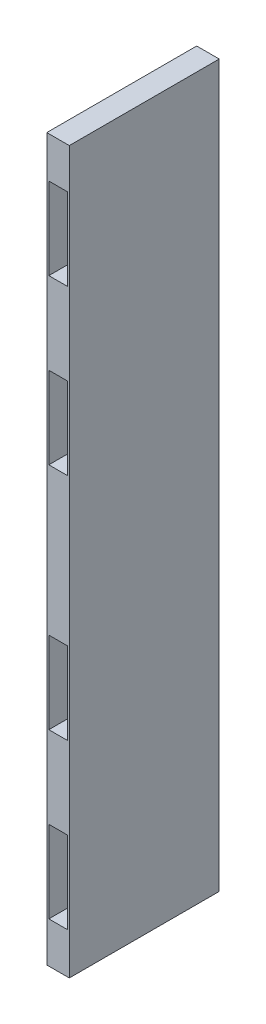
ISO-10303-21;
HEADER;
FILE_DESCRIPTION(('STEP AP214'),'2;1');
FILE_NAME('part.step','',(''),(''),'','','');
FILE_SCHEMA(('AUTOMOTIVE_DESIGN { 1 0 10303 214 1 1 1 1 }'));
ENDSEC;
DATA;
#1=APPLICATION_CONTEXT('core data for automotive mechanical design processes');
#2=APPLICATION_PROTOCOL_DEFINITION('international standard','automotive_design',2000,#1);
#3=PRODUCT_CONTEXT('',#1,'mechanical');
#4=PRODUCT('Part','Part','',(#3));
#5=PRODUCT_RELATED_PRODUCT_CATEGORY('part','',(#4));
#6=PRODUCT_DEFINITION_FORMATION('','',#4);
#7=PRODUCT_DEFINITION_CONTEXT('part definition',#1,'design');
#8=PRODUCT_DEFINITION('design','',#6,#7);
#9=PRODUCT_DEFINITION_SHAPE('','',#8);
#10=(LENGTH_UNIT() NAMED_UNIT(*) SI_UNIT(.MILLI.,.METRE.));
#11=(NAMED_UNIT(*) PLANE_ANGLE_UNIT() SI_UNIT($,.RADIAN.));
#12=(NAMED_UNIT(*) SI_UNIT($,.STERADIAN.) SOLID_ANGLE_UNIT());
#13=UNCERTAINTY_MEASURE_WITH_UNIT(LENGTH_MEASURE(1.E-05),#10,'distance_accuracy_value','');
#14=(GEOMETRIC_REPRESENTATION_CONTEXT(3) GLOBAL_UNCERTAINTY_ASSIGNED_CONTEXT((#13)) GLOBAL_UNIT_ASSIGNED_CONTEXT((#10,
#11,#12)) REPRESENTATION_CONTEXT('',''));
#15=CARTESIAN_POINT('',(0.,0.,0.));
#16=DIRECTION('',(0.,0.,1.));
#17=DIRECTION('',(1.,0.,0.));
#18=AXIS2_PLACEMENT_3D('',#15,#16,#17);
#19=CARTESIAN_POINT('',(-2.50000000000001,88.,0.));
#20=DIRECTION('',(0.,0.,-1.));
#21=DIRECTION('',(-1.,0.,0.));
#22=AXIS2_PLACEMENT_3D('',#19,#20,#21);
#23=PLANE('',#22);
#24=DIRECTION('',(0.,-1.,0.));
#25=VECTOR('',#24,1.);
#26=CARTESIAN_POINT('',(-2.50000000000001,88.,0.));
#27=LINE('',#26,#25);
#28=CARTESIAN_POINT('',(-2.50000000000001,35.,0.));
#29=VERTEX_POINT('',#28);
#30=CARTESIAN_POINT('',(-2.50000000000001,25.,0.));
#31=VERTEX_POINT('',#30);
#32=EDGE_CURVE('E320',#29,#31,#27,.T.);
#33=ORIENTED_EDGE('',*,*,#32,.F.);
#34=DIRECTION('',(-1.,0.,0.));
#35=VECTOR('',#34,1.);
#36=CARTESIAN_POINT('',(-0.250000000000007,35.,0.));
#37=LINE('',#36,#35);
#38=CARTESIAN_POINT('',(-0.250000000000007,35.,0.));
#39=VERTEX_POINT('',#38);
#40=EDGE_CURVE('E50',#39,#29,#37,.T.);
#41=ORIENTED_EDGE('',*,*,#40,.F.);
#42=DIRECTION('',(0.,1.,0.));
#43=VECTOR('',#42,1.);
#44=CARTESIAN_POINT('',(-0.250000000000007,25.,0.));
#45=LINE('',#44,#43);
#46=CARTESIAN_POINT('',(-0.250000000000007,25.,0.));
#47=VERTEX_POINT('',#46);
#48=EDGE_CURVE('E141',#47,#39,#45,.T.);
#49=ORIENTED_EDGE('',*,*,#48,.F.);
#50=DIRECTION('',(-1.,0.,0.));
#51=VECTOR('',#50,1.);
#52=CARTESIAN_POINT('',(-0.250000000000007,25.,0.));
#53=LINE('',#52,#51);
#54=EDGE_CURVE('E98',#47,#31,#53,.T.);
#55=ORIENTED_EDGE('',*,*,#54,.T.);
#56=EDGE_LOOP('',(#33,#41,#49,#55));
#57=FACE_BOUND('',#56,.T.);
#58=CARTESIAN_POINT('',(-2.50000000000001,83.,0.));
#59=VERTEX_POINT('',#58);
#60=CARTESIAN_POINT('',(-2.50000000000001,73.,0.));
#61=VERTEX_POINT('',#60);
#62=EDGE_CURVE('E316',#59,#61,#27,.T.);
#63=ORIENTED_EDGE('',*,*,#62,.F.);
#64=DIRECTION('',(-1.,0.,0.));
#65=VECTOR('',#64,1.);
#66=CARTESIAN_POINT('',(-0.250000000000007,83.,0.));
#67=LINE('',#66,#65);
#68=CARTESIAN_POINT('',(-0.250000000000007,83.,0.));
#69=VERTEX_POINT('',#68);
#70=EDGE_CURVE('E222',#69,#59,#67,.T.);
#71=ORIENTED_EDGE('',*,*,#70,.F.);
#72=DIRECTION('',(0.,-1.,0.));
#73=VECTOR('',#72,1.);
#74=CARTESIAN_POINT('',(-0.250000000000007,73.,0.));
#75=LINE('',#74,#73);
#76=CARTESIAN_POINT('',(-0.250000000000007,73.,0.));
#77=VERTEX_POINT('',#76);
#78=EDGE_CURVE('E297',#69,#77,#75,.T.);
#79=ORIENTED_EDGE('',*,*,#78,.T.);
#80=DIRECTION('',(-1.,0.,0.));
#81=VECTOR('',#80,1.);
#82=CARTESIAN_POINT('',(-0.250000000000007,73.,0.));
#83=LINE('',#82,#81);
#84=EDGE_CURVE('E219',#77,#61,#83,.T.);
#85=ORIENTED_EDGE('',*,*,#84,.T.);
#86=EDGE_LOOP('',(#63,#71,#79,#85));
#87=FACE_BOUND('',#86,.T.);
#88=CARTESIAN_POINT('',(-2.50000000000001,63.,0.));
#89=VERTEX_POINT('',#88);
#90=CARTESIAN_POINT('',(-2.50000000000001,53.,0.));
#91=VERTEX_POINT('',#90);
#92=EDGE_CURVE('E530',#89,#91,#27,.T.);
#93=ORIENTED_EDGE('',*,*,#92,.F.);
#94=DIRECTION('',(-1.,0.,0.));
#95=VECTOR('',#94,1.);
#96=CARTESIAN_POINT('',(-0.250000000000007,63.,0.));
#97=LINE('',#96,#95);
#98=CARTESIAN_POINT('',(-0.250000000000007,63.,0.));
#99=VERTEX_POINT('',#98);
#100=EDGE_CURVE('E206',#99,#89,#97,.T.);
#101=ORIENTED_EDGE('',*,*,#100,.F.);
#102=DIRECTION('',(0.,-1.,0.));
#103=VECTOR('',#102,1.);
#104=CARTESIAN_POINT('',(-0.250000000000007,63.,0.));
#105=LINE('',#104,#103);
#106=CARTESIAN_POINT('',(-0.250000000000007,53.,0.));
#107=VERTEX_POINT('',#106);
#108=EDGE_CURVE('E248',#99,#107,#105,.T.);
#109=ORIENTED_EDGE('',*,*,#108,.T.);
#110=DIRECTION('',(-1.,0.,0.));
#111=VECTOR('',#110,1.);
#112=CARTESIAN_POINT('',(-0.250000000000007,53.,0.));
#113=LINE('',#112,#111);
#114=EDGE_CURVE('E168',#107,#91,#113,.T.);
#115=ORIENTED_EDGE('',*,*,#114,.T.);
#116=EDGE_LOOP('',(#93,#101,#109,#115));
#117=FACE_BOUND('',#116,.T.);
#118=CARTESIAN_POINT('',(-2.50000000000001,15.,0.));
#119=VERTEX_POINT('',#118);
#120=CARTESIAN_POINT('',(-2.50000000000001,4.99999999999999,0.));
#121=VERTEX_POINT('',#120);
#122=EDGE_CURVE('E317',#119,#121,#27,.T.);
#123=ORIENTED_EDGE('',*,*,#122,.F.);
#124=DIRECTION('',(-1.,0.,0.));
#125=VECTOR('',#124,1.);
#126=CARTESIAN_POINT('',(-0.250000000000007,15.,0.));
#127=LINE('',#126,#125);
#128=CARTESIAN_POINT('',(-0.250000000000007,15.,0.));
#129=VERTEX_POINT('',#128);
#130=EDGE_CURVE('E124',#129,#119,#127,.T.);
#131=ORIENTED_EDGE('',*,*,#130,.F.);
#132=DIRECTION('',(0.,1.,0.));
#133=VECTOR('',#132,1.);
#134=CARTESIAN_POINT('',(-0.250000000000007,15.,0.));
#135=LINE('',#134,#133);
#136=CARTESIAN_POINT('',(-0.250000000000007,5.,0.));
#137=VERTEX_POINT('',#136);
#138=EDGE_CURVE('E180',#137,#129,#135,.T.);
#139=ORIENTED_EDGE('',*,*,#138,.F.);
#140=DIRECTION('',(-1.,0.,0.));
#141=VECTOR('',#140,1.);
#142=CARTESIAN_POINT('',(-0.250000000000007,5.,0.));
#143=LINE('',#142,#141);
#144=EDGE_CURVE('E121',#137,#121,#143,.T.);
#145=ORIENTED_EDGE('',*,*,#144,.T.);
#146=EDGE_LOOP('',(#123,#131,#139,#145));
#147=FACE_BOUND('',#146,.T.);
#148=DIRECTION('',(1.,0.,0.));
#149=VECTOR('',#148,1.);
#150=CARTESIAN_POINT('',(-2.50000000000001,88.,0.));
#151=LINE('',#150,#149);
#152=CARTESIAN_POINT('',(-2.75,88.,0.));
#153=VERTEX_POINT('',#152);
#154=CARTESIAN_POINT('',(0.,88.,0.));
#155=VERTEX_POINT('',#154);
#156=EDGE_CURVE('E93',#153,#155,#151,.T.);
#157=ORIENTED_EDGE('',*,*,#156,.F.);
#158=DIRECTION('',(0.,-1.,0.));
#159=VECTOR('',#158,1.);
#160=CARTESIAN_POINT('',(-2.75,88.,0.));
#161=LINE('',#160,#159);
#162=CARTESIAN_POINT('',(-2.75,0.,0.));
#163=VERTEX_POINT('',#162);
#164=EDGE_CURVE('E276',#153,#163,#161,.T.);
#165=ORIENTED_EDGE('',*,*,#164,.T.);
#166=DIRECTION('',(1.,0.,0.));
#167=VECTOR('',#166,1.);
#168=CARTESIAN_POINT('',(-2.50000000000001,0.,0.));
#169=LINE('',#168,#167);
#170=CARTESIAN_POINT('',(0.,0.,0.));
#171=VERTEX_POINT('',#170);
#172=EDGE_CURVE('E80',#163,#171,#169,.T.);
#173=ORIENTED_EDGE('',*,*,#172,.T.);
#174=DIRECTION('',(0.,-1.,0.));
#175=VECTOR('',#174,1.);
#176=CARTESIAN_POINT('',(0.,88.,0.));
#177=LINE('',#176,#175);
#178=EDGE_CURVE('E11',#155,#171,#177,.T.);
#179=ORIENTED_EDGE('',*,*,#178,.F.);
#180=EDGE_LOOP('',(#157,#165,#173,#179));
#181=FACE_BOUND('',#180,.T.);
#182=ADVANCED_FACE('F36',(#57,#87,#117,#147,#181),#23,.F.);
#183=CARTESIAN_POINT('',(0.,88.,-18.3));
#184=DIRECTION('',(0.,0.,1.));
#185=DIRECTION('',(1.,0.,0.));
#186=AXIS2_PLACEMENT_3D('',#183,#184,#185);
#187=PLANE('',#186);
#188=DIRECTION('',(-1.,0.,0.));
#189=VECTOR('',#188,1.);
#190=CARTESIAN_POINT('',(-0.250000000000009,27.,-18.3));
#191=LINE('',#190,#189);
#192=CARTESIAN_POINT('',(-0.250000000000009,27.,-18.3));
#193=VERTEX_POINT('',#192);
#194=CARTESIAN_POINT('',(-2.50000000000001,27.,-18.3));
#195=VERTEX_POINT('',#194);
#196=EDGE_CURVE('E109',#193,#195,#191,.T.);
#197=ORIENTED_EDGE('',*,*,#196,.T.);
#198=DIRECTION('',(0.,-1.,0.));
#199=VECTOR('',#198,1.);
#200=CARTESIAN_POINT('',(-2.50000000000001,88.,-18.3));
#201=LINE('',#200,#199);
#202=CARTESIAN_POINT('',(-2.50000000000001,13.,-18.3));
#203=VERTEX_POINT('',#202);
#204=EDGE_CURVE('E322',#195,#203,#201,.T.);
#205=ORIENTED_EDGE('',*,*,#204,.T.);
#206=DIRECTION('',(-1.,0.,0.));
#207=VECTOR('',#206,1.);
#208=CARTESIAN_POINT('',(-0.250000000000009,13.,-18.3));
#209=LINE('',#208,#207);
#210=CARTESIAN_POINT('',(-0.250000000000009,13.,-18.3));
#211=VERTEX_POINT('',#210);
#212=EDGE_CURVE('E112',#211,#203,#209,.T.);
#213=ORIENTED_EDGE('',*,*,#212,.F.);
#214=DIRECTION('',(0.,-1.,0.));
#215=VECTOR('',#214,1.);
#216=CARTESIAN_POINT('',(-0.250000000000009,27.,-18.3));
#217=LINE('',#216,#215);
#218=EDGE_CURVE('E192',#193,#211,#217,.T.);
#219=ORIENTED_EDGE('',*,*,#218,.F.);
#220=EDGE_LOOP('',(#197,#205,#213,#219));
#221=FACE_BOUND('',#220,.T.);
#222=DIRECTION('',(-1.,0.,0.));
#223=VECTOR('',#222,1.);
#224=CARTESIAN_POINT('',(-0.250000000000009,75.,-18.3));
#225=LINE('',#224,#223);
#226=CARTESIAN_POINT('',(-0.250000000000009,75.,-18.3));
#227=VERTEX_POINT('',#226);
#228=CARTESIAN_POINT('',(-2.50000000000001,75.,-18.3));
#229=VERTEX_POINT('',#228);
#230=EDGE_CURVE('E231',#227,#229,#225,.T.);
#231=ORIENTED_EDGE('',*,*,#230,.T.);
#232=CARTESIAN_POINT('',(-2.50000000000001,61.,-18.3));
#233=VERTEX_POINT('',#232);
#234=EDGE_CURVE('E321',#229,#233,#201,.T.);
#235=ORIENTED_EDGE('',*,*,#234,.T.);
#236=DIRECTION('',(-1.,0.,0.));
#237=VECTOR('',#236,1.);
#238=CARTESIAN_POINT('',(-0.250000000000009,61.,-18.3));
#239=LINE('',#238,#237);
#240=CARTESIAN_POINT('',(-0.250000000000009,61.,-18.3));
#241=VERTEX_POINT('',#240);
#242=EDGE_CURVE('E234',#241,#233,#239,.T.);
#243=ORIENTED_EDGE('',*,*,#242,.F.);
#244=DIRECTION('',(0.,1.,0.));
#245=VECTOR('',#244,1.);
#246=CARTESIAN_POINT('',(-0.250000000000009,61.,-18.3));
#247=LINE('',#246,#245);
#248=EDGE_CURVE('E285',#241,#227,#247,.T.);
#249=ORIENTED_EDGE('',*,*,#248,.T.);
#250=EDGE_LOOP('',(#231,#235,#243,#249));
#251=FACE_BOUND('',#250,.T.);
#252=DIRECTION('',(0.,-1.,0.));
#253=VECTOR('',#252,1.);
#254=CARTESIAN_POINT('',(-2.75000000000001,88.,-18.3));
#255=LINE('',#254,#253);
#256=CARTESIAN_POINT('',(-2.75000000000001,88.,-18.3));
#257=VERTEX_POINT('',#256);
#258=CARTESIAN_POINT('',(-2.75000000000001,0.,-18.3));
#259=VERTEX_POINT('',#258);
#260=EDGE_CURVE('E325',#257,#259,#255,.T.);
#261=ORIENTED_EDGE('',*,*,#260,.F.);
#262=DIRECTION('',(-1.,0.,0.));
#263=VECTOR('',#262,1.);
#264=CARTESIAN_POINT('',(0.,88.,-18.3));
#265=LINE('',#264,#263);
#266=CARTESIAN_POINT('',(0.,88.,-18.3));
#267=VERTEX_POINT('',#266);
#268=EDGE_CURVE('E88',#267,#257,#265,.T.);
#269=ORIENTED_EDGE('',*,*,#268,.F.);
#270=DIRECTION('',(0.,-1.,0.));
#271=VECTOR('',#270,1.);
#272=CARTESIAN_POINT('',(0.,88.,-18.3));
#273=LINE('',#272,#271);
#274=CARTESIAN_POINT('',(0.,0.,-18.3));
#275=VERTEX_POINT('',#274);
#276=EDGE_CURVE('E43',#267,#275,#273,.T.);
#277=ORIENTED_EDGE('',*,*,#276,.T.);
#278=DIRECTION('',(-1.,0.,0.));
#279=VECTOR('',#278,1.);
#280=CARTESIAN_POINT('',(0.,0.,-18.3));
#281=LINE('',#280,#279);
#282=EDGE_CURVE('E79',#275,#259,#281,.T.);
#283=ORIENTED_EDGE('',*,*,#282,.T.);
#284=EDGE_LOOP('',(#261,#269,#277,#283));
#285=FACE_BOUND('',#284,.T.);
#286=ADVANCED_FACE('F85',(#221,#251,#285),#187,.F.);
#287=CARTESIAN_POINT('',(0.,88.,0.));
#288=DIRECTION('',(-1.,0.,0.));
#289=DIRECTION('',(0.,0.,1.));
#290=AXIS2_PLACEMENT_3D('',#287,#288,#289);
#291=PLANE('',#290);
#292=DIRECTION('',(0.,0.,-1.));
#293=VECTOR('',#292,1.);
#294=CARTESIAN_POINT('',(0.,0.,0.));
#295=LINE('',#294,#293);
#296=EDGE_CURVE('E70',#171,#275,#295,.T.);
#297=ORIENTED_EDGE('',*,*,#296,.T.);
#298=ORIENTED_EDGE('',*,*,#276,.F.);
#299=DIRECTION('',(0.,0.,-1.));
#300=VECTOR('',#299,1.);
#301=CARTESIAN_POINT('',(0.,88.,0.));
#302=LINE('',#301,#300);
#303=EDGE_CURVE('E59',#155,#267,#302,.T.);
#304=ORIENTED_EDGE('',*,*,#303,.F.);
#305=ORIENTED_EDGE('',*,*,#178,.T.);
#306=EDGE_LOOP('',(#297,#298,#304,#305));
#307=FACE_BOUND('',#306,.T.);
#308=ADVANCED_FACE('F72',(#307),#291,.F.);
#309=CARTESIAN_POINT('',(0.,88.,0.));
#310=DIRECTION('',(0.,1.,0.));
#311=DIRECTION('',(0.,0.,1.));
#312=AXIS2_PLACEMENT_3D('',#309,#310,#311);
#313=PLANE('',#312);
#314=ORIENTED_EDGE('',*,*,#156,.T.);
#315=ORIENTED_EDGE('',*,*,#303,.T.);
#316=ORIENTED_EDGE('',*,*,#268,.T.);
#317=DIRECTION('',(0.,0.,1.));
#318=VECTOR('',#317,1.);
#319=CARTESIAN_POINT('',(-2.75000000000001,88.,-18.3));
#320=LINE('',#319,#318);
#321=EDGE_CURVE('E327',#257,#153,#320,.T.);
#322=ORIENTED_EDGE('',*,*,#321,.T.);
#323=EDGE_LOOP('',(#314,#315,#316,#322));
#324=FACE_BOUND('',#323,.T.);
#325=ADVANCED_FACE('F333',(#324),#313,.T.);
#326=CARTESIAN_POINT('',(0.,0.,0.));
#327=DIRECTION('',(0.,1.,0.));
#328=DIRECTION('',(0.,0.,1.));
#329=AXIS2_PLACEMENT_3D('',#326,#327,#328);
#330=PLANE('',#329);
#331=ORIENTED_EDGE('',*,*,#172,.F.);
#332=DIRECTION('',(0.,0.,1.));
#333=VECTOR('',#332,1.);
#334=CARTESIAN_POINT('',(-2.75000000000001,0.,-18.3));
#335=LINE('',#334,#333);
#336=EDGE_CURVE('E92',#259,#163,#335,.T.);
#337=ORIENTED_EDGE('',*,*,#336,.F.);
#338=ORIENTED_EDGE('',*,*,#282,.F.);
#339=ORIENTED_EDGE('',*,*,#296,.F.);
#340=EDGE_LOOP('',(#331,#337,#338,#339));
#341=FACE_BOUND('',#340,.T.);
#342=ADVANCED_FACE('F90',(#341),#330,.F.);
#343=CARTESIAN_POINT('',(-0.250000000000007,25.,-2.2));
#344=DIRECTION('',(0.,-1.,0.));
#345=DIRECTION('',(0.,0.,-1.));
#346=AXIS2_PLACEMENT_3D('',#343,#344,#345);
#347=PLANE('',#346);
#348=DIRECTION('',(0.,0.,1.));
#349=VECTOR('',#348,1.);
#350=CARTESIAN_POINT('',(-2.50000000000001,25.,-2.2));
#351=LINE('',#350,#349);
#352=CARTESIAN_POINT('',(-2.50000000000001,25.,-2.2));
#353=VERTEX_POINT('',#352);
#354=EDGE_CURVE('E138',#353,#31,#351,.T.);
#355=ORIENTED_EDGE('',*,*,#354,.T.);
#356=ORIENTED_EDGE('',*,*,#54,.F.);
#357=DIRECTION('',(0.,0.,1.));
#358=VECTOR('',#357,1.);
#359=CARTESIAN_POINT('',(-0.250000000000007,25.,-2.2));
#360=LINE('',#359,#358);
#361=CARTESIAN_POINT('',(-0.250000000000007,25.,-2.2));
#362=VERTEX_POINT('',#361);
#363=EDGE_CURVE('E103',#362,#47,#360,.T.);
#364=ORIENTED_EDGE('',*,*,#363,.F.);
#365=DIRECTION('',(-1.,0.,0.));
#366=VECTOR('',#365,1.);
#367=CARTESIAN_POINT('',(-0.250000000000007,25.,-2.2));
#368=LINE('',#367,#366);
#369=EDGE_CURVE('E133',#362,#353,#368,.T.);
#370=ORIENTED_EDGE('',*,*,#369,.T.);
#371=EDGE_LOOP('',(#355,#356,#364,#370));
#372=FACE_BOUND('',#371,.T.);
#373=ADVANCED_FACE('F534',(#372),#347,.F.);
#374=CARTESIAN_POINT('',(-0.250000000000007,20.,-2.85826248793695));
#375=DIRECTION('',(0.,-0.130526192220045,0.991444861373811));
#376=DIRECTION('',(0.,-0.991444861373811,-0.130526192220045));
#377=AXIS2_PLACEMENT_3D('',#374,#375,#376);
#378=PLANE('',#377);
#379=DIRECTION('',(0.,0.991444861373811,0.130526192220045));
#380=VECTOR('',#379,1.);
#381=CARTESIAN_POINT('',(-2.50000000000001,20.,-2.85826248793694));
#382=LINE('',#381,#380);
#383=CARTESIAN_POINT('',(-2.50000000000001,20.,-2.85826248793694));
#384=VERTEX_POINT('',#383);
#385=EDGE_CURVE('E142',#384,#353,#382,.T.);
#386=ORIENTED_EDGE('',*,*,#385,.T.);
#387=ORIENTED_EDGE('',*,*,#369,.F.);
#388=DIRECTION('',(0.,0.991444861373811,0.130526192220045));
#389=VECTOR('',#388,1.);
#390=CARTESIAN_POINT('',(-0.250000000000007,20.,-2.85826248793695));
#391=LINE('',#390,#389);
#392=CARTESIAN_POINT('',(-0.250000000000007,20.,-2.85826248793695));
#393=VERTEX_POINT('',#392);
#394=EDGE_CURVE('E171',#393,#362,#391,.T.);
#395=ORIENTED_EDGE('',*,*,#394,.F.);
#396=DIRECTION('',(-1.,0.,0.));
#397=VECTOR('',#396,1.);
#398=CARTESIAN_POINT('',(-0.250000000000007,20.,-2.85826248793695));
#399=LINE('',#398,#397);
#400=EDGE_CURVE('E130',#393,#384,#399,.T.);
#401=ORIENTED_EDGE('',*,*,#400,.T.);
#402=EDGE_LOOP('',(#386,#387,#395,#401));
#403=FACE_BOUND('',#402,.T.);
#404=ADVANCED_FACE('F539',(#403),#378,.F.);
#405=CARTESIAN_POINT('',(-0.250000000000007,15.,-2.2));
#406=DIRECTION('',(0.,0.130526192220045,0.991444861373811));
#407=DIRECTION('',(0.,-0.991444861373811,0.130526192220045));
#408=AXIS2_PLACEMENT_3D('',#405,#406,#407);
#409=PLANE('',#408);
#410=DIRECTION('',(0.,0.991444861373811,-0.130526192220045));
#411=VECTOR('',#410,1.);
#412=CARTESIAN_POINT('',(-2.50000000000001,15.,-2.2));
#413=LINE('',#412,#411);
#414=CARTESIAN_POINT('',(-2.50000000000001,15.,-2.2));
#415=VERTEX_POINT('',#414);
#416=EDGE_CURVE('E145',#415,#384,#413,.T.);
#417=ORIENTED_EDGE('',*,*,#416,.T.);
#418=ORIENTED_EDGE('',*,*,#400,.F.);
#419=DIRECTION('',(0.,0.991444861373811,-0.130526192220045));
#420=VECTOR('',#419,1.);
#421=CARTESIAN_POINT('',(-0.250000000000007,15.,-2.2));
#422=LINE('',#421,#420);
#423=CARTESIAN_POINT('',(-0.250000000000007,15.,-2.2));
#424=VERTEX_POINT('',#423);
#425=EDGE_CURVE('E174',#424,#393,#422,.T.);
#426=ORIENTED_EDGE('',*,*,#425,.F.);
#427=DIRECTION('',(-1.,0.,0.));
#428=VECTOR('',#427,1.);
#429=CARTESIAN_POINT('',(-0.250000000000007,15.,-2.2));
#430=LINE('',#429,#428);
#431=EDGE_CURVE('E127',#424,#415,#430,.T.);
#432=ORIENTED_EDGE('',*,*,#431,.T.);
#433=EDGE_LOOP('',(#417,#418,#426,#432));
#434=FACE_BOUND('',#433,.T.);
#435=ADVANCED_FACE('F475',(#434),#409,.F.);
#436=CARTESIAN_POINT('',(-0.250000000000007,15.,0.));
#437=DIRECTION('',(0.,1.,0.));
#438=DIRECTION('',(0.,0.,1.));
#439=AXIS2_PLACEMENT_3D('',#436,#437,#438);
#440=PLANE('',#439);
#441=DIRECTION('',(0.,0.,-1.));
#442=VECTOR('',#441,1.);
#443=CARTESIAN_POINT('',(-2.50000000000001,15.,0.));
#444=LINE('',#443,#442);
#445=EDGE_CURVE('E148',#119,#415,#444,.T.);
#446=ORIENTED_EDGE('',*,*,#445,.T.);
#447=ORIENTED_EDGE('',*,*,#431,.F.);
#448=DIRECTION('',(0.,0.,-1.));
#449=VECTOR('',#448,1.);
#450=CARTESIAN_POINT('',(-0.250000000000007,15.,0.));
#451=LINE('',#450,#449);
#452=EDGE_CURVE('E177',#129,#424,#451,.T.);
#453=ORIENTED_EDGE('',*,*,#452,.F.);
#454=ORIENTED_EDGE('',*,*,#130,.T.);
#455=EDGE_LOOP('',(#446,#447,#453,#454));
#456=FACE_BOUND('',#455,.T.);
#457=ADVANCED_FACE('F477',(#456),#440,.F.);
#458=CARTESIAN_POINT('',(-0.250000000000007,5.,0.));
#459=DIRECTION('',(0.,-1.,0.));
#460=DIRECTION('',(0.,0.,-1.));
#461=AXIS2_PLACEMENT_3D('',#458,#459,#460);
#462=PLANE('',#461);
#463=DIRECTION('',(0.,0.,1.));
#464=VECTOR('',#463,1.);
#465=CARTESIAN_POINT('',(-2.50000000000001,5.,0.));
#466=LINE('',#465,#464);
#467=CARTESIAN_POINT('',(-2.50000000000001,4.99999999999999,-8.85826248793694));
#468=VERTEX_POINT('',#467);
#469=EDGE_CURVE('E151',#468,#121,#466,.T.);
#470=ORIENTED_EDGE('',*,*,#469,.T.);
#471=ORIENTED_EDGE('',*,*,#144,.F.);
#472=DIRECTION('',(0.,0.,1.));
#473=VECTOR('',#472,1.);
#474=CARTESIAN_POINT('',(-0.250000000000007,5.,0.));
#475=LINE('',#474,#473);
#476=CARTESIAN_POINT('',(-0.250000000000008,4.99999999999999,-8.85826248793694));
#477=VERTEX_POINT('',#476);
#478=EDGE_CURVE('E183',#477,#137,#475,.T.);
#479=ORIENTED_EDGE('',*,*,#478,.F.);
#480=DIRECTION('',(-1.,0.,0.));
#481=VECTOR('',#480,1.);
#482=CARTESIAN_POINT('',(-0.250000000000008,4.99999999999999,-8.85826248793694));
#483=LINE('',#482,#481);
#484=EDGE_CURVE('E118',#477,#468,#483,.T.);
#485=ORIENTED_EDGE('',*,*,#484,.T.);
#486=EDGE_LOOP('',(#470,#471,#479,#485));
#487=FACE_BOUND('',#486,.T.);
#488=ADVANCED_FACE('F482',(#487),#462,.F.);
#489=CARTESIAN_POINT('',(-0.250000000000008,4.99999999999999,-8.85826248793694));
#490=DIRECTION('',(0.,0.,-1.));
#491=DIRECTION('',(-1.,0.,0.));
#492=AXIS2_PLACEMENT_3D('',#489,#490,#491);
#493=PLANE('',#492);
#494=DIRECTION('',(0.,-1.,0.));
#495=VECTOR('',#494,1.);
#496=CARTESIAN_POINT('',(-2.50000000000001,4.99999999999999,-8.85826248793694));
#497=LINE('',#496,#495);
#498=CARTESIAN_POINT('',(-2.50000000000001,13.,-8.85826248793694));
#499=VERTEX_POINT('',#498);
#500=EDGE_CURVE('E154',#499,#468,#497,.T.);
#501=ORIENTED_EDGE('',*,*,#500,.T.);
#502=ORIENTED_EDGE('',*,*,#484,.F.);
#503=DIRECTION('',(0.,-1.,0.));
#504=VECTOR('',#503,1.);
#505=CARTESIAN_POINT('',(-0.250000000000008,4.99999999999999,-8.85826248793694));
#506=LINE('',#505,#504);
#507=CARTESIAN_POINT('',(-0.250000000000008,13.,-8.85826248793694));
#508=VERTEX_POINT('',#507);
#509=EDGE_CURVE('E186',#508,#477,#506,.T.);
#510=ORIENTED_EDGE('',*,*,#509,.F.);
#511=DIRECTION('',(-1.,0.,0.));
#512=VECTOR('',#511,1.);
#513=CARTESIAN_POINT('',(-0.250000000000008,13.,-8.85826248793694));
#514=LINE('',#513,#512);
#515=EDGE_CURVE('E115',#508,#499,#514,.T.);
#516=ORIENTED_EDGE('',*,*,#515,.T.);
#517=EDGE_LOOP('',(#501,#502,#510,#516));
#518=FACE_BOUND('',#517,.T.);
#519=ADVANCED_FACE('F486',(#518),#493,.F.);
#520=CARTESIAN_POINT('',(-0.250000000000008,13.,-8.85826248793694));
#521=DIRECTION('',(0.,-1.,0.));
#522=DIRECTION('',(0.,0.,-1.));
#523=AXIS2_PLACEMENT_3D('',#520,#521,#522);
#524=PLANE('',#523);
#525=DIRECTION('',(0.,0.,1.));
#526=VECTOR('',#525,1.);
#527=CARTESIAN_POINT('',(-2.50000000000001,13.,-8.85826248793694));
#528=LINE('',#527,#526);
#529=EDGE_CURVE('E157',#203,#499,#528,.T.);
#530=ORIENTED_EDGE('',*,*,#529,.T.);
#531=ORIENTED_EDGE('',*,*,#515,.F.);
#532=DIRECTION('',(0.,0.,1.));
#533=VECTOR('',#532,1.);
#534=CARTESIAN_POINT('',(-0.250000000000008,13.,-8.85826248793694));
#535=LINE('',#534,#533);
#536=EDGE_CURVE('E189',#211,#508,#535,.T.);
#537=ORIENTED_EDGE('',*,*,#536,.F.);
#538=ORIENTED_EDGE('',*,*,#212,.T.);
#539=EDGE_LOOP('',(#530,#531,#537,#538));
#540=FACE_BOUND('',#539,.T.);
#541=ADVANCED_FACE('F494',(#540),#524,.F.);
#542=CARTESIAN_POINT('',(-0.250000000000008,27.,-8.85826248793694));
#543=DIRECTION('',(0.,1.,0.));
#544=DIRECTION('',(0.,0.,1.));
#545=AXIS2_PLACEMENT_3D('',#542,#543,#544);
#546=PLANE('',#545);
#547=DIRECTION('',(0.,0.,-1.));
#548=VECTOR('',#547,1.);
#549=CARTESIAN_POINT('',(-2.50000000000001,27.,-8.85826248793694));
#550=LINE('',#549,#548);
#551=CARTESIAN_POINT('',(-2.50000000000001,27.,-8.85826248793694));
#552=VERTEX_POINT('',#551);
#553=EDGE_CURVE('E160',#552,#195,#550,.T.);
#554=ORIENTED_EDGE('',*,*,#553,.T.);
#555=ORIENTED_EDGE('',*,*,#196,.F.);
#556=DIRECTION('',(0.,0.,-1.));
#557=VECTOR('',#556,1.);
#558=CARTESIAN_POINT('',(-0.250000000000008,27.,-8.85826248793694));
#559=LINE('',#558,#557);
#560=CARTESIAN_POINT('',(-0.250000000000008,27.,-8.85826248793694));
#561=VERTEX_POINT('',#560);
#562=EDGE_CURVE('E195',#561,#193,#559,.T.);
#563=ORIENTED_EDGE('',*,*,#562,.F.);
#564=DIRECTION('',(-1.,0.,0.));
#565=VECTOR('',#564,1.);
#566=CARTESIAN_POINT('',(-0.250000000000008,27.,-8.85826248793694));
#567=LINE('',#566,#565);
#568=EDGE_CURVE('E106',#561,#552,#567,.T.);
#569=ORIENTED_EDGE('',*,*,#568,.T.);
#570=EDGE_LOOP('',(#554,#555,#563,#569));
#571=FACE_BOUND('',#570,.T.);
#572=ADVANCED_FACE('F500',(#571),#546,.F.);
#573=CARTESIAN_POINT('',(-0.250000000000008,35.,-8.85826248793694));
#574=DIRECTION('',(0.,0.,-1.));
#575=DIRECTION('',(0.,1.,0.));
#576=AXIS2_PLACEMENT_3D('',#573,#574,#575);
#577=PLANE('',#576);
#578=DIRECTION('',(0.,-1.,0.));
#579=VECTOR('',#578,1.);
#580=CARTESIAN_POINT('',(-2.50000000000001,35.,-8.85826248793694));
#581=LINE('',#580,#579);
#582=CARTESIAN_POINT('',(-2.50000000000001,35.,-8.85826248793694));
#583=VERTEX_POINT('',#582);
#584=EDGE_CURVE('E163',#583,#552,#581,.T.);
#585=ORIENTED_EDGE('',*,*,#584,.T.);
#586=ORIENTED_EDGE('',*,*,#568,.F.);
#587=DIRECTION('',(0.,-1.,0.));
#588=VECTOR('',#587,1.);
#589=CARTESIAN_POINT('',(-0.250000000000008,35.,-8.85826248793694));
#590=LINE('',#589,#588);
#591=CARTESIAN_POINT('',(-0.250000000000008,35.,-8.85826248793694));
#592=VERTEX_POINT('',#591);
#593=EDGE_CURVE('E198',#592,#561,#590,.T.);
#594=ORIENTED_EDGE('',*,*,#593,.F.);
#595=DIRECTION('',(-1.,0.,0.));
#596=VECTOR('',#595,1.);
#597=CARTESIAN_POINT('',(-0.250000000000008,35.,-8.85826248793694));
#598=LINE('',#597,#596);
#599=EDGE_CURVE('E102',#592,#583,#598,.T.);
#600=ORIENTED_EDGE('',*,*,#599,.T.);
#601=EDGE_LOOP('',(#585,#586,#594,#600));
#602=FACE_BOUND('',#601,.T.);
#603=ADVANCED_FACE('F504',(#602),#577,.F.);
#604=CARTESIAN_POINT('',(-0.250000000000007,35.,0.));
#605=DIRECTION('',(0.,1.,0.));
#606=DIRECTION('',(0.,0.,1.));
#607=AXIS2_PLACEMENT_3D('',#604,#605,#606);
#608=PLANE('',#607);
#609=DIRECTION('',(0.,0.,-1.));
#610=VECTOR('',#609,1.);
#611=CARTESIAN_POINT('',(-2.50000000000001,35.,0.));
#612=LINE('',#611,#610);
#613=EDGE_CURVE('E166',#29,#583,#612,.T.);
#614=ORIENTED_EDGE('',*,*,#613,.T.);
#615=ORIENTED_EDGE('',*,*,#599,.F.);
#616=DIRECTION('',(0.,0.,-1.));
#617=VECTOR('',#616,1.);
#618=CARTESIAN_POINT('',(-0.250000000000007,35.,0.));
#619=LINE('',#618,#617);
#620=EDGE_CURVE('E201',#39,#592,#619,.T.);
#621=ORIENTED_EDGE('',*,*,#620,.F.);
#622=ORIENTED_EDGE('',*,*,#40,.T.);
#623=EDGE_LOOP('',(#614,#615,#621,#622));
#624=FACE_BOUND('',#623,.T.);
#625=ADVANCED_FACE('F505',(#624),#608,.F.);
#626=CARTESIAN_POINT('',(-0.250000000000007,0.,0.));
#627=DIRECTION('',(-1.,0.,0.));
#628=DIRECTION('',(0.,0.,1.));
#629=AXIS2_PLACEMENT_3D('',#626,#627,#628);
#630=PLANE('',#629);
#631=ORIENTED_EDGE('',*,*,#48,.T.);
#632=ORIENTED_EDGE('',*,*,#620,.T.);
#633=ORIENTED_EDGE('',*,*,#593,.T.);
#634=ORIENTED_EDGE('',*,*,#562,.T.);
#635=ORIENTED_EDGE('',*,*,#218,.T.);
#636=ORIENTED_EDGE('',*,*,#536,.T.);
#637=ORIENTED_EDGE('',*,*,#509,.T.);
#638=ORIENTED_EDGE('',*,*,#478,.T.);
#639=ORIENTED_EDGE('',*,*,#138,.T.);
#640=ORIENTED_EDGE('',*,*,#452,.T.);
#641=ORIENTED_EDGE('',*,*,#425,.T.);
#642=ORIENTED_EDGE('',*,*,#394,.T.);
#643=ORIENTED_EDGE('',*,*,#363,.T.);
#644=EDGE_LOOP('',(#631,#632,#633,#634,#635,#636,#637,#638,#639,#640,#641,#642,#643));
#645=FACE_BOUND('',#644,.T.);
#646=ADVANCED_FACE('F496',(#645),#630,.T.);
#647=CARTESIAN_POINT('',(-0.250000000000007,53.,0.));
#648=DIRECTION('',(0.,1.,0.));
#649=DIRECTION('',(0.,0.,1.));
#650=AXIS2_PLACEMENT_3D('',#647,#648,#649);
#651=PLANE('',#650);
#652=DIRECTION('',(0.,0.,-1.));
#653=VECTOR('',#652,1.);
#654=CARTESIAN_POINT('',(-2.50000000000001,53.,0.));
#655=LINE('',#654,#653);
#656=CARTESIAN_POINT('',(-2.50000000000001,53.,-8.85826248793694));
#657=VERTEX_POINT('',#656);
#658=EDGE_CURVE('E245',#91,#657,#655,.T.);
#659=ORIENTED_EDGE('',*,*,#658,.F.);
#660=ORIENTED_EDGE('',*,*,#114,.F.);
#661=DIRECTION('',(0.,0.,-1.));
#662=VECTOR('',#661,1.);
#663=CARTESIAN_POINT('',(-0.250000000000007,53.,0.));
#664=LINE('',#663,#662);
#665=CARTESIAN_POINT('',(-0.250000000000008,53.,-8.85826248793694));
#666=VERTEX_POINT('',#665);
#667=EDGE_CURVE('E210',#107,#666,#664,.T.);
#668=ORIENTED_EDGE('',*,*,#667,.T.);
#669=DIRECTION('',(-1.,0.,0.));
#670=VECTOR('',#669,1.);
#671=CARTESIAN_POINT('',(-0.250000000000008,53.,-8.85826248793694));
#672=LINE('',#671,#670);
#673=EDGE_CURVE('E240',#666,#657,#672,.T.);
#674=ORIENTED_EDGE('',*,*,#673,.T.);
#675=EDGE_LOOP('',(#659,#660,#668,#674));
#676=FACE_BOUND('',#675,.T.);
#677=ADVANCED_FACE('F512',(#676),#651,.T.);
#678=CARTESIAN_POINT('',(-0.250000000000008,53.,-8.85826248793694));
#679=DIRECTION('',(0.,0.,1.));
#680=DIRECTION('',(0.,-1.,0.));
#681=AXIS2_PLACEMENT_3D('',#678,#679,#680);
#682=PLANE('',#681);
#683=DIRECTION('',(0.,1.,0.));
#684=VECTOR('',#683,1.);
#685=CARTESIAN_POINT('',(-2.50000000000001,53.,-8.85826248793694));
#686=LINE('',#685,#684);
#687=CARTESIAN_POINT('',(-2.50000000000001,61.,-8.85826248793694));
#688=VERTEX_POINT('',#687);
#689=EDGE_CURVE('E249',#657,#688,#686,.T.);
#690=ORIENTED_EDGE('',*,*,#689,.F.);
#691=ORIENTED_EDGE('',*,*,#673,.F.);
#692=DIRECTION('',(0.,1.,0.));
#693=VECTOR('',#692,1.);
#694=CARTESIAN_POINT('',(-0.250000000000008,53.,-8.85826248793694));
#695=LINE('',#694,#693);
#696=CARTESIAN_POINT('',(-0.250000000000008,61.,-8.85826248793694));
#697=VERTEX_POINT('',#696);
#698=EDGE_CURVE('E279',#666,#697,#695,.T.);
#699=ORIENTED_EDGE('',*,*,#698,.T.);
#700=DIRECTION('',(-1.,0.,0.));
#701=VECTOR('',#700,1.);
#702=CARTESIAN_POINT('',(-0.250000000000008,61.,-8.85826248793694));
#703=LINE('',#702,#701);
#704=EDGE_CURVE('E237',#697,#688,#703,.T.);
#705=ORIENTED_EDGE('',*,*,#704,.T.);
#706=EDGE_LOOP('',(#690,#691,#699,#705));
#707=FACE_BOUND('',#706,.T.);
#708=ADVANCED_FACE('F581',(#707),#682,.T.);
#709=CARTESIAN_POINT('',(-0.250000000000008,61.,-8.85826248793694));
#710=DIRECTION('',(0.,1.,0.));
#711=DIRECTION('',(0.,0.,1.));
#712=AXIS2_PLACEMENT_3D('',#709,#710,#711);
#713=PLANE('',#712);
#714=DIRECTION('',(0.,0.,-1.));
#715=VECTOR('',#714,1.);
#716=CARTESIAN_POINT('',(-2.50000000000001,61.,-8.85826248793694));
#717=LINE('',#716,#715);
#718=EDGE_CURVE('E252',#688,#233,#717,.T.);
#719=ORIENTED_EDGE('',*,*,#718,.F.);
#720=ORIENTED_EDGE('',*,*,#704,.F.);
#721=DIRECTION('',(0.,0.,-1.));
#722=VECTOR('',#721,1.);
#723=CARTESIAN_POINT('',(-0.250000000000008,61.,-8.85826248793694));
#724=LINE('',#723,#722);
#725=EDGE_CURVE('E282',#697,#241,#724,.T.);
#726=ORIENTED_EDGE('',*,*,#725,.T.);
#727=ORIENTED_EDGE('',*,*,#242,.T.);
#728=EDGE_LOOP('',(#719,#720,#726,#727));
#729=FACE_BOUND('',#728,.T.);
#730=ADVANCED_FACE('F594',(#729),#713,.T.);
#731=CARTESIAN_POINT('',(-0.250000000000008,75.,-8.85826248793694));
#732=DIRECTION('',(0.,-1.,0.));
#733=DIRECTION('',(0.,0.,-1.));
#734=AXIS2_PLACEMENT_3D('',#731,#732,#733);
#735=PLANE('',#734);
#736=DIRECTION('',(0.,0.,1.));
#737=VECTOR('',#736,1.);
#738=CARTESIAN_POINT('',(-2.50000000000001,75.,-8.85826248793694));
#739=LINE('',#738,#737);
#740=CARTESIAN_POINT('',(-2.50000000000001,75.,-8.85826248793694));
#741=VERTEX_POINT('',#740);
#742=EDGE_CURVE('E255',#229,#741,#739,.T.);
#743=ORIENTED_EDGE('',*,*,#742,.F.);
#744=ORIENTED_EDGE('',*,*,#230,.F.);
#745=DIRECTION('',(0.,0.,1.));
#746=VECTOR('',#745,1.);
#747=CARTESIAN_POINT('',(-0.250000000000008,75.,-8.85826248793694));
#748=LINE('',#747,#746);
#749=CARTESIAN_POINT('',(-0.250000000000008,75.,-8.85826248793694));
#750=VERTEX_POINT('',#749);
#751=EDGE_CURVE('E288',#227,#750,#748,.T.);
#752=ORIENTED_EDGE('',*,*,#751,.T.);
#753=DIRECTION('',(-1.,0.,0.));
#754=VECTOR('',#753,1.);
#755=CARTESIAN_POINT('',(-0.250000000000008,75.,-8.85826248793694));
#756=LINE('',#755,#754);
#757=EDGE_CURVE('E228',#750,#741,#756,.T.);
#758=ORIENTED_EDGE('',*,*,#757,.T.);
#759=EDGE_LOOP('',(#743,#744,#752,#758));
#760=FACE_BOUND('',#759,.T.);
#761=ADVANCED_FACE('F604',(#760),#735,.T.);
#762=CARTESIAN_POINT('',(-0.250000000000008,83.,-8.85826248793694));
#763=DIRECTION('',(0.,0.,1.));
#764=DIRECTION('',(1.,0.,0.));
#765=AXIS2_PLACEMENT_3D('',#762,#763,#764);
#766=PLANE('',#765);
#767=DIRECTION('',(0.,1.,0.));
#768=VECTOR('',#767,1.);
#769=CARTESIAN_POINT('',(-2.50000000000001,83.,-8.85826248793694));
#770=LINE('',#769,#768);
#771=CARTESIAN_POINT('',(-2.50000000000001,83.,-8.85826248793694));
#772=VERTEX_POINT('',#771);
#773=EDGE_CURVE('E258',#741,#772,#770,.T.);
#774=ORIENTED_EDGE('',*,*,#773,.F.);
#775=ORIENTED_EDGE('',*,*,#757,.F.);
#776=DIRECTION('',(0.,1.,0.));
#777=VECTOR('',#776,1.);
#778=CARTESIAN_POINT('',(-0.250000000000008,83.,-8.85826248793694));
#779=LINE('',#778,#777);
#780=CARTESIAN_POINT('',(-0.250000000000008,83.,-8.85826248793694));
#781=VERTEX_POINT('',#780);
#782=EDGE_CURVE('E291',#750,#781,#779,.T.);
#783=ORIENTED_EDGE('',*,*,#782,.T.);
#784=DIRECTION('',(-1.,0.,0.));
#785=VECTOR('',#784,1.);
#786=CARTESIAN_POINT('',(-0.250000000000008,83.,-8.85826248793694));
#787=LINE('',#786,#785);
#788=EDGE_CURVE('E225',#781,#772,#787,.T.);
#789=ORIENTED_EDGE('',*,*,#788,.T.);
#790=EDGE_LOOP('',(#774,#775,#783,#789));
#791=FACE_BOUND('',#790,.T.);
#792=ADVANCED_FACE('F614',(#791),#766,.T.);
#793=CARTESIAN_POINT('',(-0.250000000000007,83.,0.));
#794=DIRECTION('',(0.,-1.,0.));
#795=DIRECTION('',(0.,0.,-1.));
#796=AXIS2_PLACEMENT_3D('',#793,#794,#795);
#797=PLANE('',#796);
#798=DIRECTION('',(0.,0.,1.));
#799=VECTOR('',#798,1.);
#800=CARTESIAN_POINT('',(-2.50000000000001,83.,0.));
#801=LINE('',#800,#799);
#802=EDGE_CURVE('E261',#772,#59,#801,.T.);
#803=ORIENTED_EDGE('',*,*,#802,.F.);
#804=ORIENTED_EDGE('',*,*,#788,.F.);
#805=DIRECTION('',(0.,0.,1.));
#806=VECTOR('',#805,1.);
#807=CARTESIAN_POINT('',(-0.250000000000007,83.,0.));
#808=LINE('',#807,#806);
#809=EDGE_CURVE('E294',#781,#69,#808,.T.);
#810=ORIENTED_EDGE('',*,*,#809,.T.);
#811=ORIENTED_EDGE('',*,*,#70,.T.);
#812=EDGE_LOOP('',(#803,#804,#810,#811));
#813=FACE_BOUND('',#812,.T.);
#814=ADVANCED_FACE('F624',(#813),#797,.T.);
#815=CARTESIAN_POINT('',(-0.250000000000007,73.,0.));
#816=DIRECTION('',(0.,1.,0.));
#817=DIRECTION('',(0.,0.,1.));
#818=AXIS2_PLACEMENT_3D('',#815,#816,#817);
#819=PLANE('',#818);
#820=DIRECTION('',(0.,0.,-1.));
#821=VECTOR('',#820,1.);
#822=CARTESIAN_POINT('',(-2.50000000000001,73.,0.));
#823=LINE('',#822,#821);
#824=CARTESIAN_POINT('',(-2.50000000000001,73.,-2.2));
#825=VERTEX_POINT('',#824);
#826=EDGE_CURVE('E264',#61,#825,#823,.T.);
#827=ORIENTED_EDGE('',*,*,#826,.F.);
#828=ORIENTED_EDGE('',*,*,#84,.F.);
#829=DIRECTION('',(0.,0.,-1.));
#830=VECTOR('',#829,1.);
#831=CARTESIAN_POINT('',(-0.250000000000007,73.,0.));
#832=LINE('',#831,#830);
#833=CARTESIAN_POINT('',(-0.250000000000007,73.,-2.2));
#834=VERTEX_POINT('',#833);
#835=EDGE_CURVE('E300',#77,#834,#832,.T.);
#836=ORIENTED_EDGE('',*,*,#835,.T.);
#837=DIRECTION('',(-1.,0.,0.));
#838=VECTOR('',#837,1.);
#839=CARTESIAN_POINT('',(-0.250000000000007,73.,-2.2));
#840=LINE('',#839,#838);
#841=EDGE_CURVE('E216',#834,#825,#840,.T.);
#842=ORIENTED_EDGE('',*,*,#841,.T.);
#843=EDGE_LOOP('',(#827,#828,#836,#842));
#844=FACE_BOUND('',#843,.T.);
#845=ADVANCED_FACE('F634',(#844),#819,.T.);
#846=CARTESIAN_POINT('',(-0.250000000000007,73.,-2.2));
#847=DIRECTION('',(0.,0.130526192220045,-0.991444861373811));
#848=DIRECTION('',(0.,0.991444861373811,0.130526192220045));
#849=AXIS2_PLACEMENT_3D('',#846,#847,#848);
#850=PLANE('',#849);
#851=DIRECTION('',(0.,-0.991444861373811,-0.130526192220045));
#852=VECTOR('',#851,1.);
#853=CARTESIAN_POINT('',(-2.50000000000001,73.,-2.2));
#854=LINE('',#853,#852);
#855=CARTESIAN_POINT('',(-2.50000000000001,68.,-2.85826248793694));
#856=VERTEX_POINT('',#855);
#857=EDGE_CURVE('E267',#825,#856,#854,.T.);
#858=ORIENTED_EDGE('',*,*,#857,.F.);
#859=ORIENTED_EDGE('',*,*,#841,.F.);
#860=DIRECTION('',(0.,-0.991444861373811,-0.130526192220045));
#861=VECTOR('',#860,1.);
#862=CARTESIAN_POINT('',(-0.250000000000007,73.,-2.2));
#863=LINE('',#862,#861);
#864=CARTESIAN_POINT('',(-0.250000000000007,68.,-2.85826248793695));
#865=VERTEX_POINT('',#864);
#866=EDGE_CURVE('E303',#834,#865,#863,.T.);
#867=ORIENTED_EDGE('',*,*,#866,.T.);
#868=DIRECTION('',(-1.,0.,0.));
#869=VECTOR('',#868,1.);
#870=CARTESIAN_POINT('',(-0.250000000000007,68.,-2.85826248793695));
#871=LINE('',#870,#869);
#872=EDGE_CURVE('E213',#865,#856,#871,.T.);
#873=ORIENTED_EDGE('',*,*,#872,.T.);
#874=EDGE_LOOP('',(#858,#859,#867,#873));
#875=FACE_BOUND('',#874,.T.);
#876=ADVANCED_FACE('F645',(#875),#850,.T.);
#877=CARTESIAN_POINT('',(-0.250000000000007,68.,-2.85826248793695));
#878=DIRECTION('',(0.,-0.130526192220045,-0.991444861373811));
#879=DIRECTION('',(0.,0.991444861373811,-0.130526192220045));
#880=AXIS2_PLACEMENT_3D('',#877,#878,#879);
#881=PLANE('',#880);
#882=DIRECTION('',(0.,-0.991444861373811,0.130526192220045));
#883=VECTOR('',#882,1.);
#884=CARTESIAN_POINT('',(-2.50000000000001,68.,-2.85826248793694));
#885=LINE('',#884,#883);
#886=CARTESIAN_POINT('',(-2.50000000000001,63.,-2.2));
#887=VERTEX_POINT('',#886);
#888=EDGE_CURVE('E270',#856,#887,#885,.T.);
#889=ORIENTED_EDGE('',*,*,#888,.F.);
#890=ORIENTED_EDGE('',*,*,#872,.F.);
#891=DIRECTION('',(0.,-0.991444861373811,0.130526192220045));
#892=VECTOR('',#891,1.);
#893=CARTESIAN_POINT('',(-0.250000000000007,68.,-2.85826248793695));
#894=LINE('',#893,#892);
#895=CARTESIAN_POINT('',(-0.250000000000007,63.,-2.2));
#896=VERTEX_POINT('',#895);
#897=EDGE_CURVE('E306',#865,#896,#894,.T.);
#898=ORIENTED_EDGE('',*,*,#897,.T.);
#899=DIRECTION('',(-1.,0.,0.));
#900=VECTOR('',#899,1.);
#901=CARTESIAN_POINT('',(-0.250000000000007,63.,-2.2));
#902=LINE('',#901,#900);
#903=EDGE_CURVE('E209',#896,#887,#902,.T.);
#904=ORIENTED_EDGE('',*,*,#903,.T.);
#905=EDGE_LOOP('',(#889,#890,#898,#904));
#906=FACE_BOUND('',#905,.T.);
#907=ADVANCED_FACE('F657',(#906),#881,.T.);
#908=CARTESIAN_POINT('',(-0.250000000000007,63.,-2.2));
#909=DIRECTION('',(0.,-1.,0.));
#910=DIRECTION('',(0.,0.,-1.));
#911=AXIS2_PLACEMENT_3D('',#908,#909,#910);
#912=PLANE('',#911);
#913=DIRECTION('',(0.,0.,1.));
#914=VECTOR('',#913,1.);
#915=CARTESIAN_POINT('',(-2.50000000000001,63.,-2.2));
#916=LINE('',#915,#914);
#917=EDGE_CURVE('E273',#887,#89,#916,.T.);
#918=ORIENTED_EDGE('',*,*,#917,.F.);
#919=ORIENTED_EDGE('',*,*,#903,.F.);
#920=DIRECTION('',(0.,0.,1.));
#921=VECTOR('',#920,1.);
#922=CARTESIAN_POINT('',(-0.250000000000007,63.,-2.2));
#923=LINE('',#922,#921);
#924=EDGE_CURVE('E309',#896,#99,#923,.T.);
#925=ORIENTED_EDGE('',*,*,#924,.T.);
#926=ORIENTED_EDGE('',*,*,#100,.T.);
#927=EDGE_LOOP('',(#918,#919,#925,#926));
#928=FACE_BOUND('',#927,.T.);
#929=ADVANCED_FACE('F668',(#928),#912,.T.);
#930=CARTESIAN_POINT('',(-0.250000000000007,88.,0.));
#931=DIRECTION('',(-1.,0.,0.));
#932=DIRECTION('',(0.,0.,1.));
#933=AXIS2_PLACEMENT_3D('',#930,#931,#932);
#934=PLANE('',#933);
#935=ORIENTED_EDGE('',*,*,#108,.F.);
#936=ORIENTED_EDGE('',*,*,#924,.F.);
#937=ORIENTED_EDGE('',*,*,#897,.F.);
#938=ORIENTED_EDGE('',*,*,#866,.F.);
#939=ORIENTED_EDGE('',*,*,#835,.F.);
#940=ORIENTED_EDGE('',*,*,#78,.F.);
#941=ORIENTED_EDGE('',*,*,#809,.F.);
#942=ORIENTED_EDGE('',*,*,#782,.F.);
#943=ORIENTED_EDGE('',*,*,#751,.F.);
#944=ORIENTED_EDGE('',*,*,#248,.F.);
#945=ORIENTED_EDGE('',*,*,#725,.F.);
#946=ORIENTED_EDGE('',*,*,#698,.F.);
#947=ORIENTED_EDGE('',*,*,#667,.F.);
#948=EDGE_LOOP('',(#935,#936,#937,#938,#939,#940,#941,#942,#943,#944,#945,#946,#947));
#949=FACE_BOUND('',#948,.T.);
#950=ADVANCED_FACE('F679',(#949),#934,.T.);
#951=CARTESIAN_POINT('',(-2.50000000000001,88.,-18.3));
#952=DIRECTION('',(-1.,0.,0.));
#953=DIRECTION('',(0.,0.,1.));
#954=AXIS2_PLACEMENT_3D('',#951,#952,#953);
#955=PLANE('',#954);
#956=ORIENTED_EDGE('',*,*,#32,.T.);
#957=ORIENTED_EDGE('',*,*,#354,.F.);
#958=ORIENTED_EDGE('',*,*,#385,.F.);
#959=ORIENTED_EDGE('',*,*,#416,.F.);
#960=ORIENTED_EDGE('',*,*,#445,.F.);
#961=ORIENTED_EDGE('',*,*,#122,.T.);
#962=ORIENTED_EDGE('',*,*,#469,.F.);
#963=ORIENTED_EDGE('',*,*,#500,.F.);
#964=ORIENTED_EDGE('',*,*,#529,.F.);
#965=ORIENTED_EDGE('',*,*,#204,.F.);
#966=ORIENTED_EDGE('',*,*,#553,.F.);
#967=ORIENTED_EDGE('',*,*,#584,.F.);
#968=ORIENTED_EDGE('',*,*,#613,.F.);
#969=EDGE_LOOP('',(#956,#957,#958,#959,#960,#961,#962,#963,#964,#965,#966,#967,#968));
#970=FACE_BOUND('',#969,.T.);
#971=ADVANCED_FACE('F471',(#970),#955,.F.);
#972=CARTESIAN_POINT('',(-2.75000000000001,88.,-18.3));
#973=DIRECTION('',(1.,0.,0.));
#974=DIRECTION('',(0.,0.,-1.));
#975=AXIS2_PLACEMENT_3D('',#972,#973,#974);
#976=PLANE('',#975);
#977=ORIENTED_EDGE('',*,*,#336,.T.);
#978=ORIENTED_EDGE('',*,*,#164,.F.);
#979=ORIENTED_EDGE('',*,*,#321,.F.);
#980=ORIENTED_EDGE('',*,*,#260,.T.);
#981=EDGE_LOOP('',(#977,#978,#979,#980));
#982=FACE_BOUND('',#981,.T.);
#983=ADVANCED_FACE('F338',(#982),#976,.F.);
#984=ORIENTED_EDGE('',*,*,#658,.T.);
#985=ORIENTED_EDGE('',*,*,#689,.T.);
#986=ORIENTED_EDGE('',*,*,#718,.T.);
#987=ORIENTED_EDGE('',*,*,#234,.F.);
#988=ORIENTED_EDGE('',*,*,#742,.T.);
#989=ORIENTED_EDGE('',*,*,#773,.T.);
#990=ORIENTED_EDGE('',*,*,#802,.T.);
#991=ORIENTED_EDGE('',*,*,#62,.T.);
#992=ORIENTED_EDGE('',*,*,#826,.T.);
#993=ORIENTED_EDGE('',*,*,#857,.T.);
#994=ORIENTED_EDGE('',*,*,#888,.T.);
#995=ORIENTED_EDGE('',*,*,#917,.T.);
#996=ORIENTED_EDGE('',*,*,#92,.T.);
#997=EDGE_LOOP('',(#984,#985,#986,#987,#988,#989,#990,#991,#992,#993,#994,#995,#996));
#998=FACE_BOUND('',#997,.T.);
#999=ADVANCED_FACE('F691',(#998),#955,.F.);
#1000=CLOSED_SHELL('',(#182,#286,#308,#325,#342,#373,#404,#435,#457,#488,#519,#541,#572,#603,
#625,#646,#677,#708,#730,#761,#792,#814,#845,#876,#907,#929,#950,#971,#983,#999));
#1001=MANIFOLD_SOLID_BREP('B2',#1000);
#1002=ADVANCED_BREP_SHAPE_REPRESENTATION('',(#18,#1001),#14);
#1003=SHAPE_DEFINITION_REPRESENTATION(#9,#1002);
ENDSEC;
END-ISO-10303-21;
